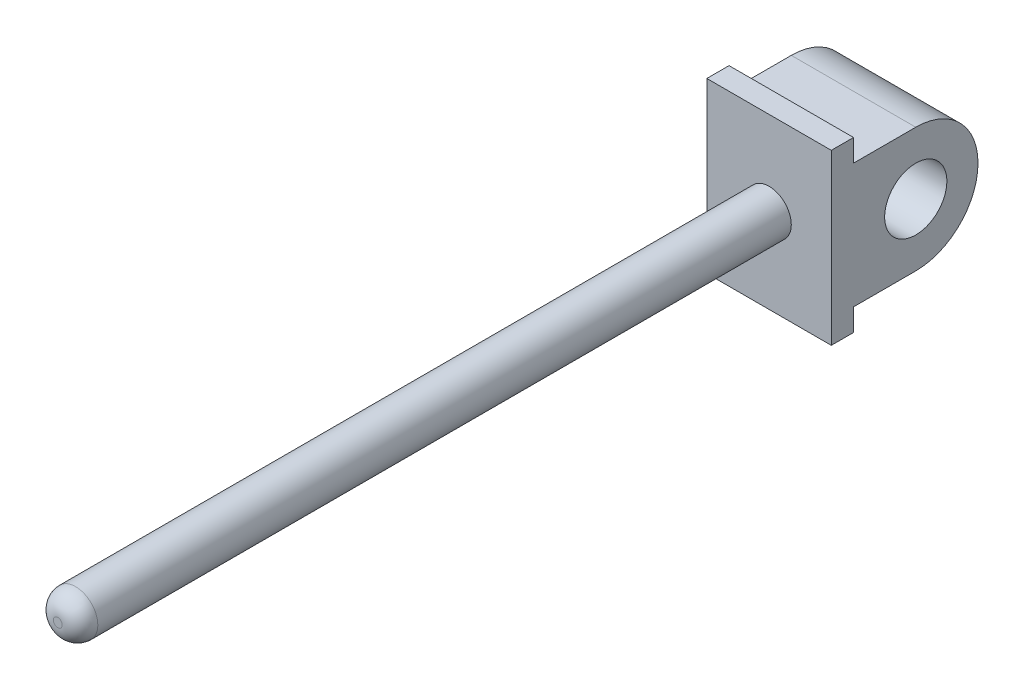
ISO-10303-21;
HEADER;
FILE_DESCRIPTION(('STEP AP214'),'2;1');
FILE_NAME('part.step','',(''),(''),'','','');
FILE_SCHEMA(('AUTOMOTIVE_DESIGN { 1 0 10303 214 1 1 1 1 }'));
ENDSEC;
DATA;
#1=APPLICATION_CONTEXT('core data for automotive mechanical design processes');
#2=APPLICATION_PROTOCOL_DEFINITION('international standard','automotive_design',2000,#1);
#3=PRODUCT_CONTEXT('',#1,'mechanical');
#4=PRODUCT('Part','Part','',(#3));
#5=PRODUCT_RELATED_PRODUCT_CATEGORY('part','',(#4));
#6=PRODUCT_DEFINITION_FORMATION('','',#4);
#7=PRODUCT_DEFINITION_CONTEXT('part definition',#1,'design');
#8=PRODUCT_DEFINITION('design','',#6,#7);
#9=PRODUCT_DEFINITION_SHAPE('','',#8);
#10=(LENGTH_UNIT() NAMED_UNIT(*) SI_UNIT(.MILLI.,.METRE.));
#11=(NAMED_UNIT(*) PLANE_ANGLE_UNIT() SI_UNIT($,.RADIAN.));
#12=(NAMED_UNIT(*) SI_UNIT($,.STERADIAN.) SOLID_ANGLE_UNIT());
#13=UNCERTAINTY_MEASURE_WITH_UNIT(LENGTH_MEASURE(1.E-05),#10,'distance_accuracy_value','');
#14=(GEOMETRIC_REPRESENTATION_CONTEXT(3) GLOBAL_UNCERTAINTY_ASSIGNED_CONTEXT((#13)) GLOBAL_UNIT_ASSIGNED_CONTEXT((#10,
#11,#12)) REPRESENTATION_CONTEXT('',''));
#15=CARTESIAN_POINT('',(0.,0.,0.));
#16=DIRECTION('',(0.,0.,1.));
#17=DIRECTION('',(1.,0.,0.));
#18=AXIS2_PLACEMENT_3D('',#15,#16,#17);
#19=CARTESIAN_POINT('',(70.,34.9999999999995,-315.));
#20=DIRECTION('',(0.,0.,1.));
#21=DIRECTION('',(1.,0.,0.));
#22=AXIS2_PLACEMENT_3D('',#19,#20,#21);
#23=PLANE('',#22);
#24=DIRECTION('',(0.,1.,0.));
#25=VECTOR('',#24,1.);
#26=CARTESIAN_POINT('',(0.,34.9999999999995,-315.));
#27=LINE('',#26,#25);
#28=CARTESIAN_POINT('',(0.,34.9999999999995,-315.));
#29=VERTEX_POINT('',#28);
#30=CARTESIAN_POINT('',(0.,47.4999999999996,-315.));
#31=VERTEX_POINT('',#30);
#32=EDGE_CURVE('E143',#29,#31,#27,.T.);
#33=ORIENTED_EDGE('',*,*,#32,.T.);
#34=DIRECTION('',(-1.,0.,0.));
#35=VECTOR('',#34,1.);
#36=CARTESIAN_POINT('',(70.,47.4999999999996,-315.));
#37=LINE('',#36,#35);
#38=CARTESIAN_POINT('',(70.,47.4999999999996,-315.));
#39=VERTEX_POINT('',#38);
#40=EDGE_CURVE('E188',#39,#31,#37,.T.);
#41=ORIENTED_EDGE('',*,*,#40,.F.);
#42=DIRECTION('',(0.,1.,0.));
#43=VECTOR('',#42,1.);
#44=CARTESIAN_POINT('',(70.,34.9999999999995,-315.));
#45=LINE('',#44,#43);
#46=CARTESIAN_POINT('',(70.,34.9999999999995,-315.));
#47=VERTEX_POINT('',#46);
#48=EDGE_CURVE('E172',#47,#39,#45,.T.);
#49=ORIENTED_EDGE('',*,*,#48,.F.);
#50=DIRECTION('',(-1.,0.,0.));
#51=VECTOR('',#50,1.);
#52=CARTESIAN_POINT('',(70.,34.9999999999995,-315.));
#53=LINE('',#52,#51);
#54=EDGE_CURVE('E57',#47,#29,#53,.T.);
#55=ORIENTED_EDGE('',*,*,#54,.T.);
#56=EDGE_LOOP('',(#33,#41,#49,#55));
#57=FACE_BOUND('',#56,.T.);
#58=ADVANCED_FACE('F39',(#57),#23,.F.);
#59=CARTESIAN_POINT('',(70.,47.4999999999996,-315.));
#60=DIRECTION('',(0.,-1.,0.));
#61=DIRECTION('',(0.,0.,-1.));
#62=AXIS2_PLACEMENT_3D('',#59,#60,#61);
#63=PLANE('',#62);
#64=DIRECTION('',(0.,0.,1.));
#65=VECTOR('',#64,1.);
#66=CARTESIAN_POINT('',(0.,47.4999999999996,-315.));
#67=LINE('',#66,#65);
#68=CARTESIAN_POINT('',(0.,47.5000000000001,-302.5));
#69=VERTEX_POINT('',#68);
#70=EDGE_CURVE('E146',#31,#69,#67,.T.);
#71=ORIENTED_EDGE('',*,*,#70,.T.);
#72=DIRECTION('',(-1.,0.,0.));
#73=VECTOR('',#72,1.);
#74=CARTESIAN_POINT('',(70.,47.5000000000001,-302.5));
#75=LINE('',#74,#73);
#76=CARTESIAN_POINT('',(70.,47.5000000000001,-302.5));
#77=VERTEX_POINT('',#76);
#78=EDGE_CURVE('E185',#77,#69,#75,.T.);
#79=ORIENTED_EDGE('',*,*,#78,.F.);
#80=DIRECTION('',(0.,0.,1.));
#81=VECTOR('',#80,1.);
#82=CARTESIAN_POINT('',(70.,47.4999999999996,-315.));
#83=LINE('',#82,#81);
#84=EDGE_CURVE('E97',#39,#77,#83,.T.);
#85=ORIENTED_EDGE('',*,*,#84,.F.);
#86=ORIENTED_EDGE('',*,*,#40,.T.);
#87=EDGE_LOOP('',(#71,#79,#85,#86));
#88=FACE_BOUND('',#87,.T.);
#89=ADVANCED_FACE('F238',(#88),#63,.F.);
#90=CARTESIAN_POINT('',(70.,-47.5,-302.5));
#91=DIRECTION('',(0.,0.,1.));
#92=DIRECTION('',(0.,-1.,0.));
#93=AXIS2_PLACEMENT_3D('',#90,#91,#92);
#94=PLANE('',#93);
#95=CARTESIAN_POINT('',(35.,0.,-302.5));
#96=DIRECTION('',(0.,0.,1.));
#97=DIRECTION('',(1.,0.,0.));
#98=AXIS2_PLACEMENT_3D('',#95,#96,#97);
#99=CIRCLE('',#98,12.5);
#100=CARTESIAN_POINT('',(47.5,0.,-302.5));
#101=VERTEX_POINT('',#100);
#102=EDGE_CURVE('E190',#101,#101,#99,.T.);
#103=ORIENTED_EDGE('',*,*,#102,.F.);
#104=EDGE_LOOP('',(#103));
#105=FACE_BOUND('',#104,.T.);
#106=DIRECTION('',(0.,1.,0.));
#107=VECTOR('',#106,1.);
#108=CARTESIAN_POINT('',(0.,-47.5,-302.5));
#109=LINE('',#108,#107);
#110=CARTESIAN_POINT('',(0.,-47.5,-302.5));
#111=VERTEX_POINT('',#110);
#112=EDGE_CURVE('E151',#111,#69,#109,.T.);
#113=ORIENTED_EDGE('',*,*,#112,.F.);
#114=DIRECTION('',(-1.,0.,0.));
#115=VECTOR('',#114,1.);
#116=CARTESIAN_POINT('',(70.,-47.5,-302.5));
#117=LINE('',#116,#115);
#118=CARTESIAN_POINT('',(70.,-47.5,-302.5));
#119=VERTEX_POINT('',#118);
#120=EDGE_CURVE('E182',#119,#111,#117,.T.);
#121=ORIENTED_EDGE('',*,*,#120,.F.);
#122=DIRECTION('',(0.,1.,0.));
#123=VECTOR('',#122,1.);
#124=CARTESIAN_POINT('',(70.,-47.5,-302.5));
#125=LINE('',#124,#123);
#126=EDGE_CURVE('E212',#119,#77,#125,.T.);
#127=ORIENTED_EDGE('',*,*,#126,.T.);
#128=ORIENTED_EDGE('',*,*,#78,.T.);
#129=EDGE_LOOP('',(#113,#121,#127,#128));
#130=FACE_BOUND('',#129,.T.);
#131=ADVANCED_FACE('F242',(#105,#130),#94,.T.);
#132=CARTESIAN_POINT('',(70.,-47.5,-315.));
#133=DIRECTION('',(0.,-1.,0.));
#134=DIRECTION('',(0.,0.,-1.));
#135=AXIS2_PLACEMENT_3D('',#132,#133,#134);
#136=PLANE('',#135);
#137=DIRECTION('',(0.,0.,1.));
#138=VECTOR('',#137,1.);
#139=CARTESIAN_POINT('',(0.,-47.5,-315.));
#140=LINE('',#139,#138);
#141=CARTESIAN_POINT('',(0.,-47.5,-315.));
#142=VERTEX_POINT('',#141);
#143=EDGE_CURVE('E155',#142,#111,#140,.T.);
#144=ORIENTED_EDGE('',*,*,#143,.F.);
#145=DIRECTION('',(-1.,0.,0.));
#146=VECTOR('',#145,1.);
#147=CARTESIAN_POINT('',(70.,-47.5,-315.));
#148=LINE('',#147,#146);
#149=CARTESIAN_POINT('',(70.,-47.5,-315.));
#150=VERTEX_POINT('',#149);
#151=EDGE_CURVE('E179',#150,#142,#148,.T.);
#152=ORIENTED_EDGE('',*,*,#151,.F.);
#153=DIRECTION('',(0.,0.,1.));
#154=VECTOR('',#153,1.);
#155=CARTESIAN_POINT('',(70.,-47.5,-315.));
#156=LINE('',#155,#154);
#157=EDGE_CURVE('E216',#150,#119,#156,.T.);
#158=ORIENTED_EDGE('',*,*,#157,.T.);
#159=ORIENTED_EDGE('',*,*,#120,.T.);
#160=EDGE_LOOP('',(#144,#152,#158,#159));
#161=FACE_BOUND('',#160,.T.);
#162=ADVANCED_FACE('F247',(#161),#136,.T.);
#163=CARTESIAN_POINT('',(70.,-35.,-315.));
#164=DIRECTION('',(0.,0.,-1.));
#165=DIRECTION('',(-1.,0.,0.));
#166=AXIS2_PLACEMENT_3D('',#163,#164,#165);
#167=PLANE('',#166);
#168=DIRECTION('',(0.,-1.,0.));
#169=VECTOR('',#168,1.);
#170=CARTESIAN_POINT('',(0.,-35.,-315.));
#171=LINE('',#170,#169);
#172=CARTESIAN_POINT('',(0.,-35.,-315.));
#173=VERTEX_POINT('',#172);
#174=EDGE_CURVE('E159',#173,#142,#171,.T.);
#175=ORIENTED_EDGE('',*,*,#174,.F.);
#176=DIRECTION('',(-1.,0.,0.));
#177=VECTOR('',#176,1.);
#178=CARTESIAN_POINT('',(70.,-35.,-315.));
#179=LINE('',#178,#177);
#180=CARTESIAN_POINT('',(70.,-35.,-315.));
#181=VERTEX_POINT('',#180);
#182=EDGE_CURVE('E133',#181,#173,#179,.T.);
#183=ORIENTED_EDGE('',*,*,#182,.F.);
#184=DIRECTION('',(0.,-1.,0.));
#185=VECTOR('',#184,1.);
#186=CARTESIAN_POINT('',(70.,-35.,-315.));
#187=LINE('',#186,#185);
#188=EDGE_CURVE('E121',#181,#150,#187,.T.);
#189=ORIENTED_EDGE('',*,*,#188,.T.);
#190=ORIENTED_EDGE('',*,*,#151,.T.);
#191=EDGE_LOOP('',(#175,#183,#189,#190));
#192=FACE_BOUND('',#191,.T.);
#193=ADVANCED_FACE('F222',(#192),#167,.T.);
#194=CARTESIAN_POINT('',(70.,-35.,-315.));
#195=DIRECTION('',(0.,1.,0.));
#196=DIRECTION('',(0.,0.,1.));
#197=AXIS2_PLACEMENT_3D('',#194,#195,#196);
#198=PLANE('',#197);
#199=DIRECTION('',(0.,0.,-1.));
#200=VECTOR('',#199,1.);
#201=CARTESIAN_POINT('',(0.,-35.,-315.));
#202=LINE('',#201,#200);
#203=CARTESIAN_POINT('',(0.,-34.9999999999999,-350.));
#204=VERTEX_POINT('',#203);
#205=EDGE_CURVE('E129',#173,#204,#202,.T.);
#206=ORIENTED_EDGE('',*,*,#205,.T.);
#207=DIRECTION('',(-1.,0.,0.));
#208=VECTOR('',#207,1.);
#209=CARTESIAN_POINT('',(70.,-34.9999999999999,-350.));
#210=LINE('',#209,#208);
#211=CARTESIAN_POINT('',(70.,-34.9999999999999,-350.));
#212=VERTEX_POINT('',#211);
#213=EDGE_CURVE('E126',#212,#204,#210,.T.);
#214=ORIENTED_EDGE('',*,*,#213,.F.);
#215=DIRECTION('',(0.,0.,-1.));
#216=VECTOR('',#215,1.);
#217=CARTESIAN_POINT('',(70.,-35.,-315.));
#218=LINE('',#217,#216);
#219=EDGE_CURVE('E113',#181,#212,#218,.T.);
#220=ORIENTED_EDGE('',*,*,#219,.F.);
#221=ORIENTED_EDGE('',*,*,#182,.T.);
#222=EDGE_LOOP('',(#206,#214,#220,#221));
#223=FACE_BOUND('',#222,.T.);
#224=ADVANCED_FACE('F127',(#223),#198,.F.);
#225=CARTESIAN_POINT('',(70.,0.,-350.));
#226=DIRECTION('',(-1.,0.,0.));
#227=DIRECTION('',(0.,0.,1.));
#228=AXIS2_PLACEMENT_3D('',#225,#226,#227);
#229=CYLINDRICAL_SURFACE('',#228,34.9999999999999);
#230=CARTESIAN_POINT('',(0.,0.,-350.));
#231=DIRECTION('',(1.,0.,0.));
#232=DIRECTION('',(0.,0.,-1.));
#233=AXIS2_PLACEMENT_3D('',#230,#231,#232);
#234=CIRCLE('',#233,34.9999999999999);
#235=CARTESIAN_POINT('',(0.,34.9999999999999,-350.));
#236=VERTEX_POINT('',#235);
#237=EDGE_CURVE('E165',#204,#236,#234,.T.);
#238=ORIENTED_EDGE('',*,*,#237,.T.);
#239=DIRECTION('',(-1.,0.,0.));
#240=VECTOR('',#239,1.);
#241=CARTESIAN_POINT('',(70.,34.9999999999999,-350.));
#242=LINE('',#241,#240);
#243=CARTESIAN_POINT('',(70.,34.9999999999999,-350.));
#244=VERTEX_POINT('',#243);
#245=EDGE_CURVE('E84',#244,#236,#242,.T.);
#246=ORIENTED_EDGE('',*,*,#245,.F.);
#247=CARTESIAN_POINT('',(70.,0.,-350.));
#248=DIRECTION('',(1.,0.,0.));
#249=DIRECTION('',(0.,0.,-1.));
#250=AXIS2_PLACEMENT_3D('',#247,#248,#249);
#251=CIRCLE('',#250,34.9999999999999);
#252=EDGE_CURVE('E118',#212,#244,#251,.T.);
#253=ORIENTED_EDGE('',*,*,#252,.F.);
#254=ORIENTED_EDGE('',*,*,#213,.T.);
#255=EDGE_LOOP('',(#238,#246,#253,#254));
#256=FACE_BOUND('',#255,.T.);
#257=ADVANCED_FACE('F135',(#256),#229,.T.);
#258=CARTESIAN_POINT('',(70.,34.9999999999995,-315.));
#259=DIRECTION('',(0.,1.,0.));
#260=DIRECTION('',(0.,0.,1.));
#261=AXIS2_PLACEMENT_3D('',#258,#259,#260);
#262=PLANE('',#261);
#263=DIRECTION('',(0.,0.,-1.));
#264=VECTOR('',#263,1.);
#265=CARTESIAN_POINT('',(0.,34.9999999999995,-315.));
#266=LINE('',#265,#264);
#267=EDGE_CURVE('E168',#29,#236,#266,.T.);
#268=ORIENTED_EDGE('',*,*,#267,.F.);
#269=ORIENTED_EDGE('',*,*,#54,.F.);
#270=DIRECTION('',(0.,0.,-1.));
#271=VECTOR('',#270,1.);
#272=CARTESIAN_POINT('',(70.,34.9999999999995,-315.));
#273=LINE('',#272,#271);
#274=EDGE_CURVE('E137',#47,#244,#273,.T.);
#275=ORIENTED_EDGE('',*,*,#274,.T.);
#276=ORIENTED_EDGE('',*,*,#245,.T.);
#277=EDGE_LOOP('',(#268,#269,#275,#276));
#278=FACE_BOUND('',#277,.T.);
#279=ADVANCED_FACE('F226',(#278),#262,.T.);
#280=CARTESIAN_POINT('',(70.,0.,-350.));
#281=DIRECTION('',(1.,0.,0.));
#282=DIRECTION('',(0.,0.,-1.));
#283=AXIS2_PLACEMENT_3D('',#280,#281,#282);
#284=PLANE('',#283);
#285=CARTESIAN_POINT('',(70.,0.,-350.));
#286=DIRECTION('',(1.,0.,0.));
#287=DIRECTION('',(0.,0.,-1.));
#288=AXIS2_PLACEMENT_3D('',#285,#286,#287);
#289=CIRCLE('',#288,17.5);
#290=CARTESIAN_POINT('',(70.,0.,-367.5));
#291=VERTEX_POINT('',#290);
#292=EDGE_CURVE('E201',#291,#291,#289,.T.);
#293=ORIENTED_EDGE('',*,*,#292,.F.);
#294=EDGE_LOOP('',(#293));
#295=FACE_BOUND('',#294,.T.);
#296=ORIENTED_EDGE('',*,*,#48,.T.);
#297=ORIENTED_EDGE('',*,*,#84,.T.);
#298=ORIENTED_EDGE('',*,*,#126,.F.);
#299=ORIENTED_EDGE('',*,*,#157,.F.);
#300=ORIENTED_EDGE('',*,*,#188,.F.);
#301=ORIENTED_EDGE('',*,*,#219,.T.);
#302=ORIENTED_EDGE('',*,*,#252,.T.);
#303=ORIENTED_EDGE('',*,*,#274,.F.);
#304=EDGE_LOOP('',(#296,#297,#298,#299,#300,#301,#302,#303));
#305=FACE_BOUND('',#304,.T.);
#306=ADVANCED_FACE('F115',(#295,#305),#284,.T.);
#307=CARTESIAN_POINT('',(0.,0.,-350.));
#308=DIRECTION('',(1.,0.,0.));
#309=DIRECTION('',(0.,0.,-1.));
#310=AXIS2_PLACEMENT_3D('',#307,#308,#309);
#311=PLANE('',#310);
#312=CARTESIAN_POINT('',(0.,0.,-350.));
#313=DIRECTION('',(1.,0.,0.));
#314=DIRECTION('',(0.,0.,-1.));
#315=AXIS2_PLACEMENT_3D('',#312,#313,#314);
#316=CIRCLE('',#315,17.5);
#317=CARTESIAN_POINT('',(0.,0.,-367.5));
#318=VERTEX_POINT('',#317);
#319=EDGE_CURVE('E147',#318,#318,#316,.F.);
#320=ORIENTED_EDGE('',*,*,#319,.F.);
#321=EDGE_LOOP('',(#320));
#322=FACE_BOUND('',#321,.T.);
#323=ORIENTED_EDGE('',*,*,#32,.F.);
#324=ORIENTED_EDGE('',*,*,#267,.T.);
#325=ORIENTED_EDGE('',*,*,#237,.F.);
#326=ORIENTED_EDGE('',*,*,#205,.F.);
#327=ORIENTED_EDGE('',*,*,#174,.T.);
#328=ORIENTED_EDGE('',*,*,#143,.T.);
#329=ORIENTED_EDGE('',*,*,#112,.T.);
#330=ORIENTED_EDGE('',*,*,#70,.F.);
#331=EDGE_LOOP('',(#323,#324,#325,#326,#327,#328,#329,#330));
#332=FACE_BOUND('',#331,.T.);
#333=ADVANCED_FACE('F225',(#322,#332),#311,.F.);
#334=CARTESIAN_POINT('',(-49.4974746830583,0.,-350.));
#335=DIRECTION('',(1.,0.,0.));
#336=DIRECTION('',(0.,0.,-1.));
#337=AXIS2_PLACEMENT_3D('',#334,#335,#336);
#338=CYLINDRICAL_SURFACE('',#337,17.5);
#339=CARTESIAN_POINT('',(0.,0.,-367.5));
#340=CARTESIAN_POINT('',(0.72916666666666,0.,-367.5));
#341=CARTESIAN_POINT('',(1.45833333333333,0.,-367.5));
#342=CARTESIAN_POINT('',(2.91666666666666,0.,-367.5));
#343=CARTESIAN_POINT('',(3.64583333333333,0.,-367.5));
#344=CARTESIAN_POINT('',(5.10416666666666,0.,-367.5));
#345=CARTESIAN_POINT('',(5.83333333333333,0.,-367.5));
#346=CARTESIAN_POINT('',(7.29166666666666,0.,-367.5));
#347=CARTESIAN_POINT('',(8.02083333333333,0.,-367.5));
#348=CARTESIAN_POINT('',(9.47916666666666,0.,-367.5));
#349=CARTESIAN_POINT('',(10.2083333333333,0.,-367.5));
#350=CARTESIAN_POINT('',(11.6666666666667,0.,-367.5));
#351=CARTESIAN_POINT('',(12.3958333333333,0.,-367.5));
#352=CARTESIAN_POINT('',(13.8541666666667,0.,-367.5));
#353=CARTESIAN_POINT('',(14.5833333333333,0.,-367.5));
#354=CARTESIAN_POINT('',(16.0416666666667,0.,-367.5));
#355=CARTESIAN_POINT('',(16.7708333333333,0.,-367.5));
#356=CARTESIAN_POINT('',(18.2291666666667,0.,-367.5));
#357=CARTESIAN_POINT('',(18.9583333333333,0.,-367.5));
#358=CARTESIAN_POINT('',(20.4166666666667,0.,-367.5));
#359=CARTESIAN_POINT('',(21.1458333333333,0.,-367.5));
#360=CARTESIAN_POINT('',(22.6041666666667,0.,-367.5));
#361=CARTESIAN_POINT('',(23.3333333333333,0.,-367.5));
#362=CARTESIAN_POINT('',(24.7916666666667,0.,-367.5));
#363=CARTESIAN_POINT('',(25.5208333333333,0.,-367.5));
#364=CARTESIAN_POINT('',(26.9791666666667,0.,-367.5));
#365=CARTESIAN_POINT('',(27.7083333333333,0.,-367.5));
#366=CARTESIAN_POINT('',(29.1666666666667,0.,-367.5));
#367=CARTESIAN_POINT('',(29.8958333333333,0.,-367.5));
#368=CARTESIAN_POINT('',(31.3541666666666,0.,-367.5));
#369=CARTESIAN_POINT('',(32.0833333333333,0.,-367.5));
#370=CARTESIAN_POINT('',(33.5416666666667,0.,-367.5));
#371=CARTESIAN_POINT('',(34.2708333333333,0.,-367.5));
#372=CARTESIAN_POINT('',(35.7291666666667,0.,-367.5));
#373=CARTESIAN_POINT('',(36.4583333333333,0.,-367.5));
#374=CARTESIAN_POINT('',(37.9166666666667,0.,-367.5));
#375=CARTESIAN_POINT('',(38.6458333333333,0.,-367.5));
#376=CARTESIAN_POINT('',(40.1041666666667,0.,-367.5));
#377=CARTESIAN_POINT('',(40.8333333333333,0.,-367.5));
#378=CARTESIAN_POINT('',(42.2916666666667,0.,-367.5));
#379=CARTESIAN_POINT('',(43.0208333333333,0.,-367.5));
#380=CARTESIAN_POINT('',(44.4791666666667,0.,-367.5));
#381=CARTESIAN_POINT('',(45.2083333333333,0.,-367.5));
#382=CARTESIAN_POINT('',(46.6666666666667,0.,-367.5));
#383=CARTESIAN_POINT('',(47.3958333333333,0.,-367.5));
#384=CARTESIAN_POINT('',(48.8541666666667,0.,-367.5));
#385=CARTESIAN_POINT('',(49.5833333333333,0.,-367.5));
#386=CARTESIAN_POINT('',(51.0416666666667,0.,-367.5));
#387=CARTESIAN_POINT('',(51.7708333333333,0.,-367.5));
#388=CARTESIAN_POINT('',(53.2291666666667,0.,-367.5));
#389=CARTESIAN_POINT('',(53.9583333333333,0.,-367.5));
#390=CARTESIAN_POINT('',(55.4166666666667,0.,-367.5));
#391=CARTESIAN_POINT('',(56.1458333333333,0.,-367.5));
#392=CARTESIAN_POINT('',(57.6041666666667,0.,-367.5));
#393=CARTESIAN_POINT('',(58.3333333333333,0.,-367.5));
#394=CARTESIAN_POINT('',(59.7916666666667,0.,-367.5));
#395=CARTESIAN_POINT('',(60.5208333333333,0.,-367.5));
#396=CARTESIAN_POINT('',(61.9791666666667,0.,-367.5));
#397=CARTESIAN_POINT('',(62.7083333333333,0.,-367.5));
#398=CARTESIAN_POINT('',(64.1666666666667,0.,-367.5));
#399=CARTESIAN_POINT('',(64.8958333333333,0.,-367.5));
#400=CARTESIAN_POINT('',(66.3541666666667,0.,-367.5));
#401=CARTESIAN_POINT('',(67.0833333333333,0.,-367.5));
#402=CARTESIAN_POINT('',(68.5416666666667,0.,-367.5));
#403=CARTESIAN_POINT('',(69.2708333333333,0.,-367.5));
#404=CARTESIAN_POINT('',(70.,0.,-367.5));
#405=B_SPLINE_CURVE_WITH_KNOTS('',3,(#339,#340,#341,#342,#343,#344,#345,#346,#347,#348,#349,
#350,#351,#352,#353,#354,#355,#356,#357,#358,#359,#360,#361,#362,#363,#364,#365,#366,#367,#368,
#369,#370,#371,#372,#373,#374,#375,#376,#377,#378,#379,#380,#381,#382,#383,#384,#385,#386,#387,
#388,#389,#390,#391,#392,#393,#394,#395,#396,#397,#398,#399,#400,#401,#402,#403,#404),
.UNSPECIFIED.,.F.,.F.,(4,2,2,2,2,2,2,2,2,2,2,2,2,2,2,2,2,2,2,2,2,2,2,2,2,2,2,2,2,2,2,2,4),(0.,
2.1875,4.375,6.5625,8.75,10.9375,13.125,15.3125,17.5,19.6875,21.875,24.0625,26.25,28.4375,
30.625,32.8125,35.,37.1875,39.375,41.5625,43.75,45.9375,48.125,50.3125,52.5,54.6875,56.875,
59.0625,61.25,63.4375,65.625,67.8125,70.),.UNSPECIFIED.);
#406=EDGE_CURVE('BSEAM282',#318,#291,#405,.T.);
#407=ORIENTED_EDGE('',*,*,#319,.T.);
#408=ORIENTED_EDGE('',*,*,#292,.T.);
#409=ORIENTED_EDGE('',*,*,#406,.T.);
#410=ORIENTED_EDGE('',*,*,#406,.F.);
#411=EDGE_LOOP('',(#407,#409,#408,#410));
#412=FACE_BOUND('',#411,.T.);
#413=ADVANCED_FACE('F282',(#412),#338,.F.);
#414=CARTESIAN_POINT('',(35.,0.,97.5000000000001));
#415=DIRECTION('',(0.,0.,-1.));
#416=DIRECTION('',(-1.,0.,0.));
#417=AXIS2_PLACEMENT_3D('',#414,#415,#416);
#418=CYLINDRICAL_SURFACE('',#417,12.5);
#419=CARTESIAN_POINT('',(35.,0.,87.5000000000001));
#420=DIRECTION('',(0.,0.,1.));
#421=DIRECTION('',(1.,0.,0.));
#422=AXIS2_PLACEMENT_3D('',#419,#420,#421);
#423=CIRCLE('',#422,12.5);
#424=CARTESIAN_POINT('',(47.5,0.,87.5000000000001));
#425=VERTEX_POINT('',#424);
#426=EDGE_CURVE('E11',#425,#425,#423,.F.);
#427=ORIENTED_EDGE('',*,*,#426,.T.);
#428=EDGE_LOOP('',(#427));
#429=FACE_BOUND('',#428,.T.);
#430=ORIENTED_EDGE('',*,*,#102,.T.);
#431=EDGE_LOOP('',(#430));
#432=FACE_BOUND('',#431,.T.);
#433=ADVANCED_FACE('F291',(#429,#432),#418,.T.);
#434=CARTESIAN_POINT('',(35.,0.,97.5000000000001));
#435=DIRECTION('',(0.,0.,1.));
#436=DIRECTION('',(1.,0.,0.));
#437=AXIS2_PLACEMENT_3D('',#434,#435,#436);
#438=PLANE('',#437);
#439=CARTESIAN_POINT('',(35.,0.,97.5000000000001));
#440=DIRECTION('',(0.,0.,1.));
#441=DIRECTION('',(1.,0.,0.));
#442=AXIS2_PLACEMENT_3D('',#439,#440,#441);
#443=CIRCLE('',#442,2.5);
#444=CARTESIAN_POINT('',(37.5,0.,97.5000000000001));
#445=VERTEX_POINT('',#444);
#446=EDGE_CURVE('E49',#445,#445,#443,.T.);
#447=ORIENTED_EDGE('',*,*,#446,.T.);
#448=EDGE_LOOP('',(#447));
#449=FACE_BOUND('',#448,.T.);
#450=ADVANCED_FACE('F309',(#449),#438,.T.);
#451=CARTESIAN_POINT('',(35.,0.,87.5000000000001));
#452=DIRECTION('',(0.,0.,1.));
#453=DIRECTION('',(1.,0.,0.));
#454=AXIS2_PLACEMENT_3D('',#451,#452,#453);
#455=DEGENERATE_TOROIDAL_SURFACE('',#454,2.5,10.,.T.);
#456=ORIENTED_EDGE('',*,*,#426,.F.);
#457=EDGE_LOOP('',(#456));
#458=FACE_BOUND('',#457,.T.);
#459=ORIENTED_EDGE('',*,*,#446,.F.);
#460=EDGE_LOOP('',(#459));
#461=FACE_BOUND('',#460,.T.);
#462=ADVANCED_FACE('F41',(#458,#461),#455,.T.);
#463=CLOSED_SHELL('',(#58,#89,#131,#162,#193,#224,#257,#279,#306,#333,#413,#433,#450,#462));
#464=MANIFOLD_SOLID_BREP('B2',#463);
#465=ADVANCED_BREP_SHAPE_REPRESENTATION('',(#18,#464),#14);
#466=SHAPE_DEFINITION_REPRESENTATION(#9,#465);
ENDSEC;
END-ISO-10303-21;
